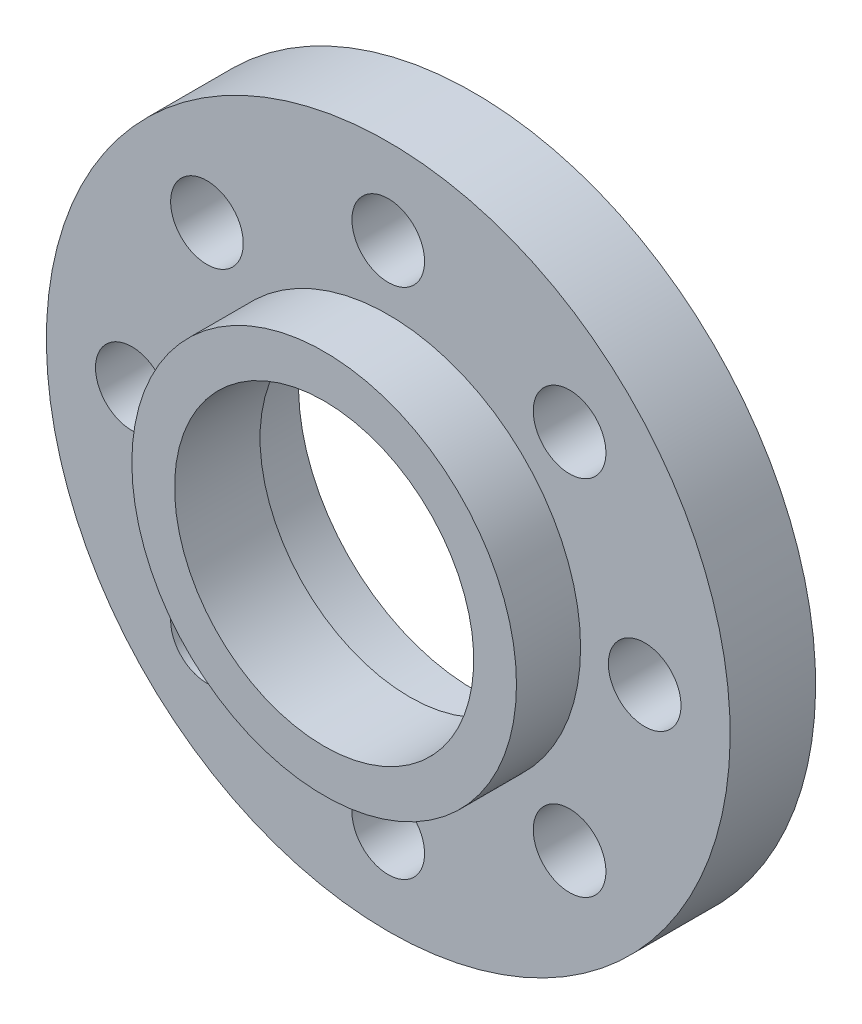
ISO-10303-21;
HEADER;
FILE_DESCRIPTION(('STEP AP214'),'2;1');
FILE_NAME('part.step','',(''),(''),'','','');
FILE_SCHEMA(('AUTOMOTIVE_DESIGN { 1 0 10303 214 1 1 1 1 }'));
ENDSEC;
DATA;
#1=APPLICATION_CONTEXT('core data for automotive mechanical design processes');
#2=APPLICATION_PROTOCOL_DEFINITION('international standard','automotive_design',2000,#1);
#3=PRODUCT_CONTEXT('',#1,'mechanical');
#4=PRODUCT('Part','Part','',(#3));
#5=PRODUCT_RELATED_PRODUCT_CATEGORY('part','',(#4));
#6=PRODUCT_DEFINITION_FORMATION('','',#4);
#7=PRODUCT_DEFINITION_CONTEXT('part definition',#1,'design');
#8=PRODUCT_DEFINITION('design','',#6,#7);
#9=PRODUCT_DEFINITION_SHAPE('','',#8);
#10=(LENGTH_UNIT() NAMED_UNIT(*) SI_UNIT(.MILLI.,.METRE.));
#11=(NAMED_UNIT(*) PLANE_ANGLE_UNIT() SI_UNIT($,.RADIAN.));
#12=(NAMED_UNIT(*) SI_UNIT($,.STERADIAN.) SOLID_ANGLE_UNIT());
#13=UNCERTAINTY_MEASURE_WITH_UNIT(LENGTH_MEASURE(1.E-05),#10,'distance_accuracy_value','');
#14=(GEOMETRIC_REPRESENTATION_CONTEXT(3) GLOBAL_UNCERTAINTY_ASSIGNED_CONTEXT((#13)) GLOBAL_UNIT_ASSIGNED_CONTEXT((#10,
#11,#12)) REPRESENTATION_CONTEXT('',''));
#15=CARTESIAN_POINT('',(0.,0.,0.));
#16=DIRECTION('',(0.,0.,1.));
#17=DIRECTION('',(1.,0.,0.));
#18=AXIS2_PLACEMENT_3D('',#15,#16,#17);
#19=CARTESIAN_POINT('',(-4.95,-4.95,-21.5));
#20=DIRECTION('',(0.,0.,1.));
#21=DIRECTION('',(1.,0.,0.));
#22=AXIS2_PLACEMENT_3D('',#19,#20,#21);
#23=PLANE('',#22);
#24=CARTESIAN_POINT('',(0.,0.,-21.5));
#25=DIRECTION('',(0.,0.,-1.));
#26=DIRECTION('',(0.,1.,0.));
#27=AXIS2_PLACEMENT_3D('',#24,#25,#26);
#28=CIRCLE('',#27,3.5);
#29=CARTESIAN_POINT('',(0.,3.5,-21.5));
#30=VERTEX_POINT('',#29);
#31=EDGE_CURVE('E17',#30,#30,#28,.T.);
#32=ORIENTED_EDGE('',*,*,#31,.T.);
#33=EDGE_LOOP('',(#32));
#34=FACE_BOUND('',#33,.T.);
#35=CARTESIAN_POINT('',(0.,0.,-21.5));
#36=DIRECTION('',(0.,0.,1.));
#37=DIRECTION('',(1.,0.,0.));
#38=AXIS2_PLACEMENT_3D('',#35,#36,#37);
#39=CIRCLE('',#38,4.5);
#40=CARTESIAN_POINT('',(4.5,0.,-21.5));
#41=VERTEX_POINT('',#40);
#42=EDGE_CURVE('E87',#41,#41,#39,.F.);
#43=ORIENTED_EDGE('',*,*,#42,.F.);
#44=EDGE_LOOP('',(#43));
#45=FACE_BOUND('',#44,.T.);
#46=ADVANCED_FACE('F14',(#34,#45),#23,.T.);
#47=CARTESIAN_POINT('',(0.,0.,-21.78));
#48=DIRECTION('',(0.,0.,-1.));
#49=DIRECTION('',(0.,1.,0.));
#50=AXIS2_PLACEMENT_3D('',#47,#48,#49);
#51=CYLINDRICAL_SURFACE('',#50,3.5);
#52=CARTESIAN_POINT('',(0.,0.,-23.5));
#53=DIRECTION('',(0.,0.,-1.));
#54=DIRECTION('',(0.,1.,0.));
#55=AXIS2_PLACEMENT_3D('',#52,#53,#54);
#56=CIRCLE('',#55,3.5);
#57=CARTESIAN_POINT('',(0.,3.5,-23.5));
#58=VERTEX_POINT('',#57);
#59=EDGE_CURVE('E85',#58,#58,#56,.F.);
#60=ORIENTED_EDGE('',*,*,#59,.F.);
#61=EDGE_LOOP('',(#60));
#62=FACE_BOUND('',#61,.T.);
#63=ORIENTED_EDGE('',*,*,#31,.F.);
#64=EDGE_LOOP('',(#63));
#65=FACE_BOUND('',#64,.T.);
#66=ADVANCED_FACE('F96',(#62,#65),#51,.F.);
#67=CARTESIAN_POINT('',(0.,0.,-21.8));
#68=DIRECTION('',(0.,0.,1.));
#69=DIRECTION('',(1.,0.,0.));
#70=AXIS2_PLACEMENT_3D('',#67,#68,#69);
#71=CYLINDRICAL_SURFACE('',#70,4.5);
#72=ORIENTED_EDGE('',*,*,#42,.T.);
#73=EDGE_LOOP('',(#72));
#74=FACE_BOUND('',#73,.T.);
#75=CARTESIAN_POINT('',(0.,0.,-23.));
#76=DIRECTION('',(0.,0.,1.));
#77=DIRECTION('',(1.,0.,0.));
#78=AXIS2_PLACEMENT_3D('',#75,#76,#77);
#79=CIRCLE('',#78,4.5);
#80=CARTESIAN_POINT('',(4.5,0.,-23.));
#81=VERTEX_POINT('',#80);
#82=EDGE_CURVE('E82',#81,#81,#79,.F.);
#83=ORIENTED_EDGE('',*,*,#82,.F.);
#84=EDGE_LOOP('',(#83));
#85=FACE_BOUND('',#84,.T.);
#86=ADVANCED_FACE('F98',(#74,#85),#71,.T.);
#87=CARTESIAN_POINT('',(-4.51,4.51,-23.5));
#88=DIRECTION('',(0.,0.,-1.));
#89=DIRECTION('',(-1.,0.,0.));
#90=AXIS2_PLACEMENT_3D('',#87,#88,#89);
#91=PLANE('',#90);
#92=ORIENTED_EDGE('',*,*,#59,.T.);
#93=EDGE_LOOP('',(#92));
#94=FACE_BOUND('',#93,.T.);
#95=CARTESIAN_POINT('',(0.,0.,-23.5));
#96=DIRECTION('',(0.,0.,-1.));
#97=DIRECTION('',(0.,1.,0.));
#98=AXIS2_PLACEMENT_3D('',#95,#96,#97);
#99=CIRCLE('',#98,4.1);
#100=CARTESIAN_POINT('',(0.,4.1,-23.5));
#101=VERTEX_POINT('',#100);
#102=EDGE_CURVE('E76',#101,#101,#99,.T.);
#103=ORIENTED_EDGE('',*,*,#102,.T.);
#104=EDGE_LOOP('',(#103));
#105=FACE_BOUND('',#104,.T.);
#106=ADVANCED_FACE('F105',(#94,#105),#91,.T.);
#107=CARTESIAN_POINT('',(-9.6,-9.6,-23.));
#108=DIRECTION('',(0.,0.,1.));
#109=DIRECTION('',(1.,0.,0.));
#110=AXIS2_PLACEMENT_3D('',#107,#108,#109);
#111=PLANE('',#110);
#112=CARTESIAN_POINT('',(0.,6.,-23.));
#113=DIRECTION('',(0.,0.,-1.));
#114=DIRECTION('',(-1.,0.,0.));
#115=AXIS2_PLACEMENT_3D('',#112,#113,#114);
#116=CIRCLE('',#115,0.850000000000001);
#117=CARTESIAN_POINT('',(-0.849999999999999,6.,-23.));
#118=VERTEX_POINT('',#117);
#119=EDGE_CURVE('E52',#118,#118,#116,.T.);
#120=ORIENTED_EDGE('',*,*,#119,.T.);
#121=EDGE_LOOP('',(#120));
#122=FACE_BOUND('',#121,.T.);
#123=CARTESIAN_POINT('',(-4.24264068711923,4.24264068711934,-23.));
#124=DIRECTION('',(0.,0.,-1.));
#125=DIRECTION('',(-1.,0.,0.));
#126=AXIS2_PLACEMENT_3D('',#123,#124,#125);
#127=CIRCLE('',#126,0.849999999999999);
#128=CARTESIAN_POINT('',(-5.09264068711923,4.24264068711934,-23.));
#129=VERTEX_POINT('',#128);
#130=EDGE_CURVE('E55',#129,#129,#127,.T.);
#131=ORIENTED_EDGE('',*,*,#130,.T.);
#132=EDGE_LOOP('',(#131));
#133=FACE_BOUND('',#132,.T.);
#134=CARTESIAN_POINT('',(-6.,0.,-23.));
#135=DIRECTION('',(0.,0.,-1.));
#136=DIRECTION('',(-1.,0.,0.));
#137=AXIS2_PLACEMENT_3D('',#134,#135,#136);
#138=CIRCLE('',#137,0.85);
#139=CARTESIAN_POINT('',(-6.85,0.,-23.));
#140=VERTEX_POINT('',#139);
#141=EDGE_CURVE('E58',#140,#140,#138,.T.);
#142=ORIENTED_EDGE('',*,*,#141,.T.);
#143=EDGE_LOOP('',(#142));
#144=FACE_BOUND('',#143,.T.);
#145=CARTESIAN_POINT('',(-4.24264068711932,-4.24264068711925,-23.));
#146=DIRECTION('',(0.,0.,-1.));
#147=DIRECTION('',(-1.,0.,0.));
#148=AXIS2_PLACEMENT_3D('',#145,#146,#147);
#149=CIRCLE('',#148,0.85);
#150=CARTESIAN_POINT('',(-5.09264068711932,-4.24264068711925,-23.));
#151=VERTEX_POINT('',#150);
#152=EDGE_CURVE('E61',#151,#151,#149,.T.);
#153=ORIENTED_EDGE('',*,*,#152,.T.);
#154=EDGE_LOOP('',(#153));
#155=FACE_BOUND('',#154,.T.);
#156=CARTESIAN_POINT('',(0.,-6.,-23.));
#157=DIRECTION('',(0.,0.,-1.));
#158=DIRECTION('',(-1.,0.,0.));
#159=AXIS2_PLACEMENT_3D('',#156,#157,#158);
#160=CIRCLE('',#159,0.850000000000001);
#161=CARTESIAN_POINT('',(-0.850000000000043,-6.,-23.));
#162=VERTEX_POINT('',#161);
#163=EDGE_CURVE('E64',#162,#162,#160,.T.);
#164=ORIENTED_EDGE('',*,*,#163,.T.);
#165=EDGE_LOOP('',(#164));
#166=FACE_BOUND('',#165,.T.);
#167=CARTESIAN_POINT('',(4.24264068711926,-4.24264068711931,-23.));
#168=DIRECTION('',(0.,0.,-1.));
#169=DIRECTION('',(-1.,0.,0.));
#170=AXIS2_PLACEMENT_3D('',#167,#168,#169);
#171=CIRCLE('',#170,0.849999999999999);
#172=CARTESIAN_POINT('',(3.39264068711926,-4.24264068711931,-23.));
#173=VERTEX_POINT('',#172);
#174=EDGE_CURVE('E67',#173,#173,#171,.T.);
#175=ORIENTED_EDGE('',*,*,#174,.T.);
#176=EDGE_LOOP('',(#175));
#177=FACE_BOUND('',#176,.T.);
#178=CARTESIAN_POINT('',(6.,0.,-23.));
#179=DIRECTION('',(0.,0.,-1.));
#180=DIRECTION('',(-1.,0.,0.));
#181=AXIS2_PLACEMENT_3D('',#178,#179,#180);
#182=CIRCLE('',#181,0.849999999999997);
#183=CARTESIAN_POINT('',(5.15,0.,-23.));
#184=VERTEX_POINT('',#183);
#185=EDGE_CURVE('E70',#184,#184,#182,.T.);
#186=ORIENTED_EDGE('',*,*,#185,.T.);
#187=EDGE_LOOP('',(#186));
#188=FACE_BOUND('',#187,.T.);
#189=CARTESIAN_POINT('',(4.24264068711929,4.24264068711928,-23.));
#190=DIRECTION('',(0.,0.,-1.));
#191=DIRECTION('',(-1.,0.,0.));
#192=AXIS2_PLACEMENT_3D('',#189,#190,#191);
#193=CIRCLE('',#192,0.850000000000002);
#194=CARTESIAN_POINT('',(3.39264068711929,4.24264068711928,-23.));
#195=VERTEX_POINT('',#194);
#196=EDGE_CURVE('E73',#195,#195,#193,.T.);
#197=ORIENTED_EDGE('',*,*,#196,.T.);
#198=EDGE_LOOP('',(#197));
#199=FACE_BOUND('',#198,.T.);
#200=ORIENTED_EDGE('',*,*,#82,.T.);
#201=EDGE_LOOP('',(#200));
#202=FACE_BOUND('',#201,.T.);
#203=CARTESIAN_POINT('',(0.,0.,-23.));
#204=DIRECTION('',(0.,0.,1.));
#205=DIRECTION('',(0.,-1.,0.));
#206=AXIS2_PLACEMENT_3D('',#203,#204,#205);
#207=CIRCLE('',#206,7.99999999999999);
#208=CARTESIAN_POINT('',(0.,-8.,-23.));
#209=VERTEX_POINT('',#208);
#210=EDGE_CURVE('E79',#209,#209,#207,.F.);
#211=ORIENTED_EDGE('',*,*,#210,.F.);
#212=EDGE_LOOP('',(#211));
#213=FACE_BOUND('',#212,.T.);
#214=ADVANCED_FACE('F154',(#122,#133,#144,#155,#166,#177,#188,#199,#202,#213),#111,.T.);
#215=CARTESIAN_POINT('',(0.,0.,-23.4));
#216=DIRECTION('',(0.,0.,1.));
#217=DIRECTION('',(0.,-1.,0.));
#218=AXIS2_PLACEMENT_3D('',#215,#216,#217);
#219=CYLINDRICAL_SURFACE('',#218,7.99999999999999);
#220=ORIENTED_EDGE('',*,*,#210,.T.);
#221=EDGE_LOOP('',(#220));
#222=FACE_BOUND('',#221,.T.);
#223=CARTESIAN_POINT('',(0.,0.,-25.));
#224=DIRECTION('',(0.,0.,1.));
#225=DIRECTION('',(0.,-1.,0.));
#226=AXIS2_PLACEMENT_3D('',#223,#224,#225);
#227=CIRCLE('',#226,7.99999999999999);
#228=CARTESIAN_POINT('',(0.,-8.,-25.));
#229=VERTEX_POINT('',#228);
#230=EDGE_CURVE('E49',#229,#229,#227,.F.);
#231=ORIENTED_EDGE('',*,*,#230,.F.);
#232=EDGE_LOOP('',(#231));
#233=FACE_BOUND('',#232,.T.);
#234=ADVANCED_FACE('F150',(#222,#233),#219,.T.);
#235=CARTESIAN_POINT('',(0.,0.,-23.71));
#236=DIRECTION('',(0.,0.,-1.));
#237=DIRECTION('',(0.,1.,0.));
#238=AXIS2_PLACEMENT_3D('',#235,#236,#237);
#239=CYLINDRICAL_SURFACE('',#238,4.1);
#240=CARTESIAN_POINT('',(0.,0.,-25.));
#241=DIRECTION('',(0.,0.,-1.));
#242=DIRECTION('',(0.,1.,0.));
#243=AXIS2_PLACEMENT_3D('',#240,#241,#242);
#244=CIRCLE('',#243,4.1);
#245=CARTESIAN_POINT('',(0.,4.1,-25.));
#246=VERTEX_POINT('',#245);
#247=EDGE_CURVE('E46',#246,#246,#244,.F.);
#248=ORIENTED_EDGE('',*,*,#247,.F.);
#249=EDGE_LOOP('',(#248));
#250=FACE_BOUND('',#249,.T.);
#251=ORIENTED_EDGE('',*,*,#102,.F.);
#252=EDGE_LOOP('',(#251));
#253=FACE_BOUND('',#252,.T.);
#254=ADVANCED_FACE('F146',(#250,#253),#239,.F.);
#255=CARTESIAN_POINT('',(4.24264068711929,4.24264068711928,-24.3));
#256=DIRECTION('',(0.,0.,-1.));
#257=DIRECTION('',(-1.,0.,0.));
#258=AXIS2_PLACEMENT_3D('',#255,#256,#257);
#259=CYLINDRICAL_SURFACE('',#258,0.850000000000002);
#260=CARTESIAN_POINT('',(4.24264068711929,4.24264068711928,-25.));
#261=DIRECTION('',(0.,0.,-1.));
#262=DIRECTION('',(-1.,0.,0.));
#263=AXIS2_PLACEMENT_3D('',#260,#261,#262);
#264=CIRCLE('',#263,0.850000000000002);
#265=CARTESIAN_POINT('',(3.39264068711929,4.24264068711928,-25.));
#266=VERTEX_POINT('',#265);
#267=EDGE_CURVE('E43',#266,#266,#264,.F.);
#268=ORIENTED_EDGE('',*,*,#267,.F.);
#269=EDGE_LOOP('',(#268));
#270=FACE_BOUND('',#269,.T.);
#271=ORIENTED_EDGE('',*,*,#196,.F.);
#272=EDGE_LOOP('',(#271));
#273=FACE_BOUND('',#272,.T.);
#274=ADVANCED_FACE('F142',(#270,#273),#259,.F.);
#275=CARTESIAN_POINT('',(6.,0.,-24.3));
#276=DIRECTION('',(0.,0.,-1.));
#277=DIRECTION('',(-1.,0.,0.));
#278=AXIS2_PLACEMENT_3D('',#275,#276,#277);
#279=CYLINDRICAL_SURFACE('',#278,0.849999999999997);
#280=CARTESIAN_POINT('',(6.,0.,-25.));
#281=DIRECTION('',(0.,0.,-1.));
#282=DIRECTION('',(-1.,0.,0.));
#283=AXIS2_PLACEMENT_3D('',#280,#281,#282);
#284=CIRCLE('',#283,0.849999999999997);
#285=CARTESIAN_POINT('',(5.15,0.,-25.));
#286=VERTEX_POINT('',#285);
#287=EDGE_CURVE('E40',#286,#286,#284,.F.);
#288=ORIENTED_EDGE('',*,*,#287,.F.);
#289=EDGE_LOOP('',(#288));
#290=FACE_BOUND('',#289,.T.);
#291=ORIENTED_EDGE('',*,*,#185,.F.);
#292=EDGE_LOOP('',(#291));
#293=FACE_BOUND('',#292,.T.);
#294=ADVANCED_FACE('F138',(#290,#293),#279,.F.);
#295=CARTESIAN_POINT('',(4.24264068711926,-4.24264068711931,-24.3));
#296=DIRECTION('',(0.,0.,-1.));
#297=DIRECTION('',(-1.,0.,0.));
#298=AXIS2_PLACEMENT_3D('',#295,#296,#297);
#299=CYLINDRICAL_SURFACE('',#298,0.849999999999999);
#300=CARTESIAN_POINT('',(4.24264068711926,-4.24264068711931,-25.));
#301=DIRECTION('',(0.,0.,-1.));
#302=DIRECTION('',(-1.,0.,0.));
#303=AXIS2_PLACEMENT_3D('',#300,#301,#302);
#304=CIRCLE('',#303,0.849999999999999);
#305=CARTESIAN_POINT('',(3.39264068711926,-4.24264068711931,-25.));
#306=VERTEX_POINT('',#305);
#307=EDGE_CURVE('E37',#306,#306,#304,.F.);
#308=ORIENTED_EDGE('',*,*,#307,.F.);
#309=EDGE_LOOP('',(#308));
#310=FACE_BOUND('',#309,.T.);
#311=ORIENTED_EDGE('',*,*,#174,.F.);
#312=EDGE_LOOP('',(#311));
#313=FACE_BOUND('',#312,.T.);
#314=ADVANCED_FACE('F134',(#310,#313),#299,.F.);
#315=CARTESIAN_POINT('',(0.,-6.,-24.3));
#316=DIRECTION('',(0.,0.,-1.));
#317=DIRECTION('',(-1.,0.,0.));
#318=AXIS2_PLACEMENT_3D('',#315,#316,#317);
#319=CYLINDRICAL_SURFACE('',#318,0.850000000000001);
#320=CARTESIAN_POINT('',(0.,-6.,-25.));
#321=DIRECTION('',(0.,0.,-1.));
#322=DIRECTION('',(-1.,0.,0.));
#323=AXIS2_PLACEMENT_3D('',#320,#321,#322);
#324=CIRCLE('',#323,0.850000000000001);
#325=CARTESIAN_POINT('',(-0.850000000000043,-6.,-25.));
#326=VERTEX_POINT('',#325);
#327=EDGE_CURVE('E34',#326,#326,#324,.F.);
#328=ORIENTED_EDGE('',*,*,#327,.F.);
#329=EDGE_LOOP('',(#328));
#330=FACE_BOUND('',#329,.T.);
#331=ORIENTED_EDGE('',*,*,#163,.F.);
#332=EDGE_LOOP('',(#331));
#333=FACE_BOUND('',#332,.T.);
#334=ADVANCED_FACE('F130',(#330,#333),#319,.F.);
#335=CARTESIAN_POINT('',(-4.24264068711932,-4.24264068711925,-24.3));
#336=DIRECTION('',(0.,0.,-1.));
#337=DIRECTION('',(-1.,0.,0.));
#338=AXIS2_PLACEMENT_3D('',#335,#336,#337);
#339=CYLINDRICAL_SURFACE('',#338,0.85);
#340=CARTESIAN_POINT('',(-4.24264068711932,-4.24264068711925,-25.));
#341=DIRECTION('',(0.,0.,-1.));
#342=DIRECTION('',(-1.,0.,0.));
#343=AXIS2_PLACEMENT_3D('',#340,#341,#342);
#344=CIRCLE('',#343,0.85);
#345=CARTESIAN_POINT('',(-5.09264068711932,-4.24264068711925,-25.));
#346=VERTEX_POINT('',#345);
#347=EDGE_CURVE('E31',#346,#346,#344,.F.);
#348=ORIENTED_EDGE('',*,*,#347,.F.);
#349=EDGE_LOOP('',(#348));
#350=FACE_BOUND('',#349,.T.);
#351=ORIENTED_EDGE('',*,*,#152,.F.);
#352=EDGE_LOOP('',(#351));
#353=FACE_BOUND('',#352,.T.);
#354=ADVANCED_FACE('F126',(#350,#353),#339,.F.);
#355=CARTESIAN_POINT('',(-6.,0.,-24.3));
#356=DIRECTION('',(0.,0.,-1.));
#357=DIRECTION('',(-1.,0.,0.));
#358=AXIS2_PLACEMENT_3D('',#355,#356,#357);
#359=CYLINDRICAL_SURFACE('',#358,0.85);
#360=CARTESIAN_POINT('',(-6.,0.,-25.));
#361=DIRECTION('',(0.,0.,-1.));
#362=DIRECTION('',(-1.,0.,0.));
#363=AXIS2_PLACEMENT_3D('',#360,#361,#362);
#364=CIRCLE('',#363,0.85);
#365=CARTESIAN_POINT('',(-6.85,0.,-25.));
#366=VERTEX_POINT('',#365);
#367=EDGE_CURVE('E26',#366,#366,#364,.F.);
#368=ORIENTED_EDGE('',*,*,#367,.F.);
#369=EDGE_LOOP('',(#368));
#370=FACE_BOUND('',#369,.T.);
#371=ORIENTED_EDGE('',*,*,#141,.F.);
#372=EDGE_LOOP('',(#371));
#373=FACE_BOUND('',#372,.T.);
#374=ADVANCED_FACE('F122',(#370,#373),#359,.F.);
#375=CARTESIAN_POINT('',(-4.24264068711923,4.24264068711934,-24.3));
#376=DIRECTION('',(0.,0.,-1.));
#377=DIRECTION('',(-1.,0.,0.));
#378=AXIS2_PLACEMENT_3D('',#375,#376,#377);
#379=CYLINDRICAL_SURFACE('',#378,0.849999999999999);
#380=CARTESIAN_POINT('',(-4.24264068711923,4.24264068711934,-25.));
#381=DIRECTION('',(0.,0.,-1.));
#382=DIRECTION('',(-1.,0.,0.));
#383=AXIS2_PLACEMENT_3D('',#380,#381,#382);
#384=CIRCLE('',#383,0.849999999999999);
#385=CARTESIAN_POINT('',(-5.09264068711923,4.24264068711934,-25.));
#386=VERTEX_POINT('',#385);
#387=EDGE_CURVE('E21',#386,#386,#384,.F.);
#388=ORIENTED_EDGE('',*,*,#387,.F.);
#389=EDGE_LOOP('',(#388));
#390=FACE_BOUND('',#389,.T.);
#391=ORIENTED_EDGE('',*,*,#130,.F.);
#392=EDGE_LOOP('',(#391));
#393=FACE_BOUND('',#392,.T.);
#394=ADVANCED_FACE('F115',(#390,#393),#379,.F.);
#395=CARTESIAN_POINT('',(0.,6.,-24.3));
#396=DIRECTION('',(0.,0.,-1.));
#397=DIRECTION('',(-1.,0.,0.));
#398=AXIS2_PLACEMENT_3D('',#395,#396,#397);
#399=CYLINDRICAL_SURFACE('',#398,0.850000000000001);
#400=CARTESIAN_POINT('',(0.,6.,-25.));
#401=DIRECTION('',(0.,0.,-1.));
#402=DIRECTION('',(-1.,0.,0.));
#403=AXIS2_PLACEMENT_3D('',#400,#401,#402);
#404=CIRCLE('',#403,0.850000000000001);
#405=CARTESIAN_POINT('',(-0.849999999999999,6.,-25.));
#406=VERTEX_POINT('',#405);
#407=EDGE_CURVE('E10',#406,#406,#404,.F.);
#408=ORIENTED_EDGE('',*,*,#407,.F.);
#409=EDGE_LOOP('',(#408));
#410=FACE_BOUND('',#409,.T.);
#411=ORIENTED_EDGE('',*,*,#119,.F.);
#412=EDGE_LOOP('',(#411));
#413=FACE_BOUND('',#412,.T.);
#414=ADVANCED_FACE('F110',(#410,#413),#399,.F.);
#415=CARTESIAN_POINT('',(-8.8,8.8,-25.));
#416=DIRECTION('',(0.,0.,-1.));
#417=DIRECTION('',(-1.,0.,0.));
#418=AXIS2_PLACEMENT_3D('',#415,#416,#417);
#419=PLANE('',#418);
#420=ORIENTED_EDGE('',*,*,#407,.T.);
#421=EDGE_LOOP('',(#420));
#422=FACE_BOUND('',#421,.T.);
#423=ORIENTED_EDGE('',*,*,#387,.T.);
#424=EDGE_LOOP('',(#423));
#425=FACE_BOUND('',#424,.T.);
#426=ORIENTED_EDGE('',*,*,#367,.T.);
#427=EDGE_LOOP('',(#426));
#428=FACE_BOUND('',#427,.T.);
#429=ORIENTED_EDGE('',*,*,#347,.T.);
#430=EDGE_LOOP('',(#429));
#431=FACE_BOUND('',#430,.T.);
#432=ORIENTED_EDGE('',*,*,#327,.T.);
#433=EDGE_LOOP('',(#432));
#434=FACE_BOUND('',#433,.T.);
#435=ORIENTED_EDGE('',*,*,#307,.T.);
#436=EDGE_LOOP('',(#435));
#437=FACE_BOUND('',#436,.T.);
#438=ORIENTED_EDGE('',*,*,#287,.T.);
#439=EDGE_LOOP('',(#438));
#440=FACE_BOUND('',#439,.T.);
#441=ORIENTED_EDGE('',*,*,#267,.T.);
#442=EDGE_LOOP('',(#441));
#443=FACE_BOUND('',#442,.T.);
#444=ORIENTED_EDGE('',*,*,#247,.T.);
#445=EDGE_LOOP('',(#444));
#446=FACE_BOUND('',#445,.T.);
#447=ORIENTED_EDGE('',*,*,#230,.T.);
#448=EDGE_LOOP('',(#447));
#449=FACE_BOUND('',#448,.T.);
#450=ADVANCED_FACE('F108',(#422,#425,#428,#431,#434,#437,#440,#443,#446,#449),#419,.T.);
#451=CLOSED_SHELL('',(#46,#66,#86,#106,#214,#234,#254,#274,#294,#314,#334,#354,#374,#394,#414,#450));
#452=MANIFOLD_SOLID_BREP('B1',#451);
#453=ADVANCED_BREP_SHAPE_REPRESENTATION('',(#18,#452),#14);
#454=SHAPE_DEFINITION_REPRESENTATION(#9,#453);
ENDSEC;
END-ISO-10303-21;
